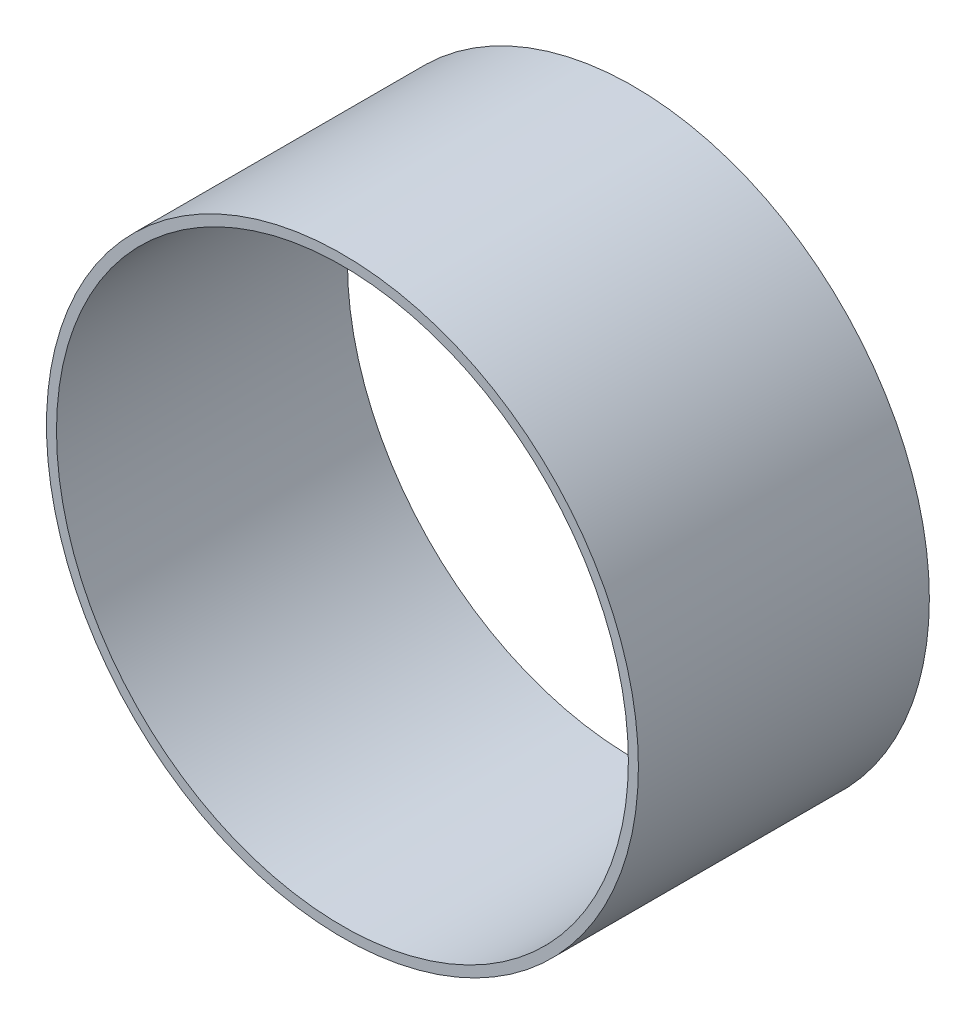
ISO-10303-21;
HEADER;
FILE_DESCRIPTION(('STEP AP214'),'2;1');
FILE_NAME('part.step','',(''),(''),'','','');
FILE_SCHEMA(('AUTOMOTIVE_DESIGN { 1 0 10303 214 1 1 1 1 }'));
ENDSEC;
DATA;
#1=APPLICATION_CONTEXT('core data for automotive mechanical design processes');
#2=APPLICATION_PROTOCOL_DEFINITION('international standard','automotive_design',2000,#1);
#3=PRODUCT_CONTEXT('',#1,'mechanical');
#4=PRODUCT('Part','Part','',(#3));
#5=PRODUCT_RELATED_PRODUCT_CATEGORY('part','',(#4));
#6=PRODUCT_DEFINITION_FORMATION('','',#4);
#7=PRODUCT_DEFINITION_CONTEXT('part definition',#1,'design');
#8=PRODUCT_DEFINITION('design','',#6,#7);
#9=PRODUCT_DEFINITION_SHAPE('','',#8);
#10=(LENGTH_UNIT() NAMED_UNIT(*) SI_UNIT(.MILLI.,.METRE.));
#11=(NAMED_UNIT(*) PLANE_ANGLE_UNIT() SI_UNIT($,.RADIAN.));
#12=(NAMED_UNIT(*) SI_UNIT($,.STERADIAN.) SOLID_ANGLE_UNIT());
#13=UNCERTAINTY_MEASURE_WITH_UNIT(LENGTH_MEASURE(1.E-05),#10,'distance_accuracy_value','');
#14=(GEOMETRIC_REPRESENTATION_CONTEXT(3) GLOBAL_UNCERTAINTY_ASSIGNED_CONTEXT((#13)) GLOBAL_UNIT_ASSIGNED_CONTEXT((#10,
#11,#12)) REPRESENTATION_CONTEXT('',''));
#15=CARTESIAN_POINT('',(0.,0.,0.));
#16=DIRECTION('',(0.,0.,1.));
#17=DIRECTION('',(1.,0.,0.));
#18=AXIS2_PLACEMENT_3D('',#15,#16,#17);
#19=CARTESIAN_POINT('',(0.,0.,47.5));
#20=DIRECTION('',(0.,0.,1.));
#21=DIRECTION('',(1.,0.,0.));
#22=AXIS2_PLACEMENT_3D('',#19,#20,#21);
#23=PLANE('',#22);
#24=CARTESIAN_POINT('',(0.,0.,47.5));
#25=DIRECTION('',(0.,0.,1.));
#26=DIRECTION('',(1.,0.,0.));
#27=AXIS2_PLACEMENT_3D('',#24,#25,#26);
#28=CIRCLE('',#27,88.5);
#29=CARTESIAN_POINT('',(88.5,0.,47.5));
#30=VERTEX_POINT('',#29);
#31=EDGE_CURVE('E10',#30,#30,#28,.T.);
#32=ORIENTED_EDGE('',*,*,#31,.T.);
#33=EDGE_LOOP('',(#32));
#34=FACE_BOUND('',#33,.T.);
#35=CARTESIAN_POINT('',(0.,0.,47.5));
#36=DIRECTION('',(0.,0.,1.));
#37=DIRECTION('',(1.,0.,0.));
#38=AXIS2_PLACEMENT_3D('',#35,#36,#37);
#39=CIRCLE('',#38,85.5);
#40=CARTESIAN_POINT('',(85.5,0.,47.5));
#41=VERTEX_POINT('',#40);
#42=EDGE_CURVE('E50',#41,#41,#39,.T.);
#43=ORIENTED_EDGE('',*,*,#42,.F.);
#44=EDGE_LOOP('',(#43));
#45=FACE_BOUND('',#44,.T.);
#46=ADVANCED_FACE('F36',(#34,#45),#23,.T.);
#47=CARTESIAN_POINT('',(0.,0.,-39.5));
#48=DIRECTION('',(0.,0.,1.));
#49=DIRECTION('',(1.,0.,0.));
#50=AXIS2_PLACEMENT_3D('',#47,#48,#49);
#51=PLANE('',#50);
#52=CARTESIAN_POINT('',(0.,0.,-39.5));
#53=DIRECTION('',(0.,0.,1.));
#54=DIRECTION('',(1.,0.,0.));
#55=AXIS2_PLACEMENT_3D('',#52,#53,#54);
#56=CIRCLE('',#55,88.5);
#57=CARTESIAN_POINT('',(88.5,0.,-39.5));
#58=VERTEX_POINT('',#57);
#59=EDGE_CURVE('E40',#58,#58,#56,.T.);
#60=ORIENTED_EDGE('',*,*,#59,.F.);
#61=EDGE_LOOP('',(#60));
#62=FACE_BOUND('',#61,.T.);
#63=CARTESIAN_POINT('',(0.,0.,-39.5));
#64=DIRECTION('',(0.,0.,1.));
#65=DIRECTION('',(1.,0.,0.));
#66=AXIS2_PLACEMENT_3D('',#63,#64,#65);
#67=CIRCLE('',#66,85.5);
#68=CARTESIAN_POINT('',(85.5,0.,-39.5));
#69=VERTEX_POINT('',#68);
#70=EDGE_CURVE('E52',#69,#69,#67,.T.);
#71=ORIENTED_EDGE('',*,*,#70,.T.);
#72=EDGE_LOOP('',(#71));
#73=FACE_BOUND('',#72,.T.);
#74=ADVANCED_FACE('F63',(#62,#73),#51,.F.);
#75=CARTESIAN_POINT('',(0.,0.,47.5));
#76=DIRECTION('',(0.,0.,-1.));
#77=DIRECTION('',(-1.,0.,0.));
#78=AXIS2_PLACEMENT_3D('',#75,#76,#77);
#79=CYLINDRICAL_SURFACE('',#78,88.5);
#80=ORIENTED_EDGE('',*,*,#31,.F.);
#81=EDGE_LOOP('',(#80));
#82=FACE_BOUND('',#81,.T.);
#83=ORIENTED_EDGE('',*,*,#59,.T.);
#84=EDGE_LOOP('',(#83));
#85=FACE_BOUND('',#84,.T.);
#86=ADVANCED_FACE('F38',(#82,#85),#79,.T.);
#87=CARTESIAN_POINT('',(0.,0.,47.5));
#88=DIRECTION('',(0.,0.,-1.));
#89=DIRECTION('',(-1.,0.,0.));
#90=AXIS2_PLACEMENT_3D('',#87,#88,#89);
#91=CYLINDRICAL_SURFACE('',#90,85.5);
#92=ORIENTED_EDGE('',*,*,#42,.T.);
#93=EDGE_LOOP('',(#92));
#94=FACE_BOUND('',#93,.T.);
#95=ORIENTED_EDGE('',*,*,#70,.F.);
#96=EDGE_LOOP('',(#95));
#97=FACE_BOUND('',#96,.T.);
#98=ADVANCED_FACE('F59',(#94,#97),#91,.F.);
#99=CLOSED_SHELL('',(#46,#74,#86,#98));
#100=MANIFOLD_SOLID_BREP('B2',#99);
#101=ADVANCED_BREP_SHAPE_REPRESENTATION('',(#18,#100),#14);
#102=SHAPE_DEFINITION_REPRESENTATION(#9,#101);
ENDSEC;
END-ISO-10303-21;
